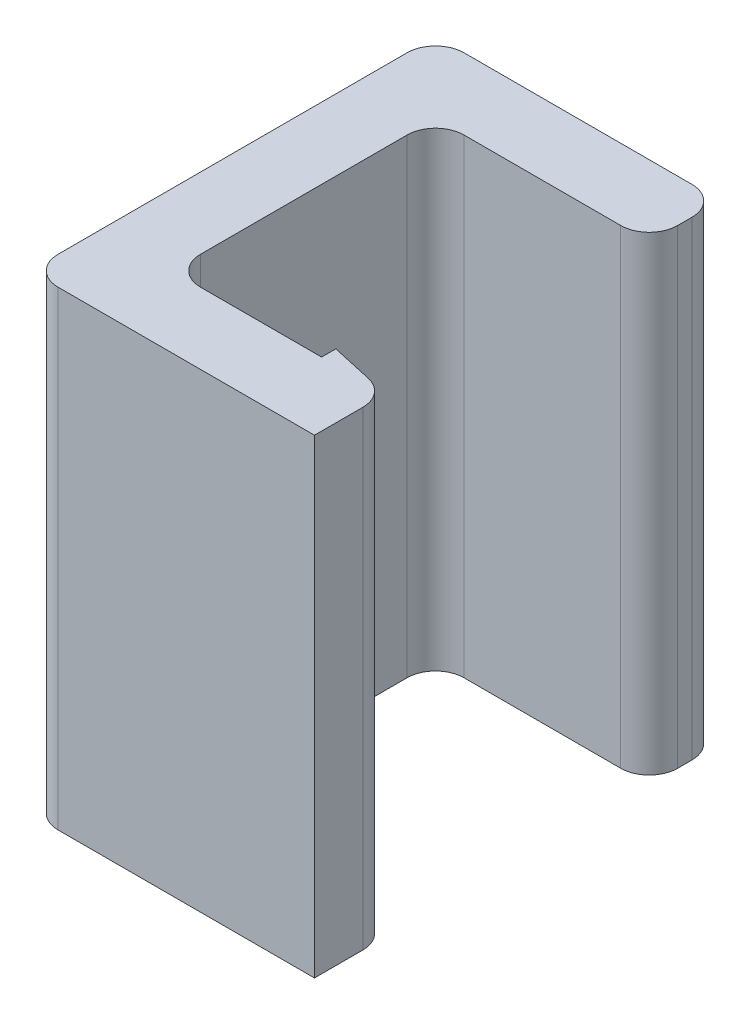
ISO-10303-21;
HEADER;
FILE_DESCRIPTION(('STEP AP214'),'2;1');
FILE_NAME('part.step','',(''),(''),'','','');
FILE_SCHEMA(('AUTOMOTIVE_DESIGN { 1 0 10303 214 1 1 1 1 }'));
ENDSEC;
DATA;
#1=APPLICATION_CONTEXT('core data for automotive mechanical design processes');
#2=APPLICATION_PROTOCOL_DEFINITION('international standard','automotive_design',2000,#1);
#3=PRODUCT_CONTEXT('',#1,'mechanical');
#4=PRODUCT('Part','Part','',(#3));
#5=PRODUCT_RELATED_PRODUCT_CATEGORY('part','',(#4));
#6=PRODUCT_DEFINITION_FORMATION('','',#4);
#7=PRODUCT_DEFINITION_CONTEXT('part definition',#1,'design');
#8=PRODUCT_DEFINITION('design','',#6,#7);
#9=PRODUCT_DEFINITION_SHAPE('','',#8);
#10=(LENGTH_UNIT() NAMED_UNIT(*) SI_UNIT(.MILLI.,.METRE.));
#11=(NAMED_UNIT(*) PLANE_ANGLE_UNIT() SI_UNIT($,.RADIAN.));
#12=(NAMED_UNIT(*) SI_UNIT($,.STERADIAN.) SOLID_ANGLE_UNIT());
#13=UNCERTAINTY_MEASURE_WITH_UNIT(LENGTH_MEASURE(1.E-05),#10,'distance_accuracy_value','');
#14=(GEOMETRIC_REPRESENTATION_CONTEXT(3) GLOBAL_UNCERTAINTY_ASSIGNED_CONTEXT((#13)) GLOBAL_UNIT_ASSIGNED_CONTEXT((#10,
#11,#12)) REPRESENTATION_CONTEXT('',''));
#15=CARTESIAN_POINT('',(0.,0.,0.));
#16=DIRECTION('',(0.,0.,1.));
#17=DIRECTION('',(1.,0.,0.));
#18=AXIS2_PLACEMENT_3D('',#15,#16,#17);
#19=CARTESIAN_POINT('',(0.705882352941176,33.,-3.17647058823529));
#20=DIRECTION('',(-0.216930457818656,0.,0.976187060183953));
#21=DIRECTION('',(0.976187060183953,0.,0.216930457818656));
#22=AXIS2_PLACEMENT_3D('',#19,#20,#21);
#23=PLANE('',#22);
#24=DIRECTION('',(-0.976187060183953,0.,-0.216930457818656));
#25=VECTOR('',#24,1.);
#26=CARTESIAN_POINT('',(0.705882352941176,33.,-3.17647058823529));
#27=LINE('',#26,#25);
#28=CARTESIAN_POINT('',(13.4338609156373,33.,-0.348030907636152));
#29=VERTEX_POINT('',#28);
#30=CARTESIAN_POINT('',(10.5,33.,-1.));
#31=VERTEX_POINT('',#30);
#32=EDGE_CURVE('E168',#29,#31,#27,.T.);
#33=ORIENTED_EDGE('',*,*,#32,.F.);
#34=DIRECTION('',(0.,-1.,0.));
#35=VECTOR('',#34,1.);
#36=CARTESIAN_POINT('',(13.4338609156373,33.,-0.348030907636152));
#37=LINE('',#36,#35);
#38=CARTESIAN_POINT('',(13.4338609156373,0.,-0.348030907636152));
#39=VERTEX_POINT('',#38);
#40=EDGE_CURVE('E242',#29,#39,#37,.T.);
#41=ORIENTED_EDGE('',*,*,#40,.T.);
#42=DIRECTION('',(-0.976187060183953,0.,-0.216930457818656));
#43=VECTOR('',#42,1.);
#44=CARTESIAN_POINT('',(0.705882352941176,0.,-3.17647058823529));
#45=LINE('',#44,#43);
#46=CARTESIAN_POINT('',(10.5,0.,-1.));
#47=VERTEX_POINT('',#46);
#48=EDGE_CURVE('E195',#39,#47,#45,.T.);
#49=ORIENTED_EDGE('',*,*,#48,.T.);
#50=DIRECTION('',(0.,-1.,0.));
#51=VECTOR('',#50,1.);
#52=CARTESIAN_POINT('',(10.5,33.,-1.));
#53=LINE('',#52,#51);
#54=EDGE_CURVE('E187',#31,#47,#53,.T.);
#55=ORIENTED_EDGE('',*,*,#54,.F.);
#56=EDGE_LOOP('',(#33,#41,#49,#55));
#57=FACE_BOUND('',#56,.T.);
#58=ADVANCED_FACE('F45',(#57),#23,.F.);
#59=CARTESIAN_POINT('',(10.5,33.,0.));
#60=DIRECTION('',(1.,0.,0.));
#61=DIRECTION('',(0.,0.,-1.));
#62=AXIS2_PLACEMENT_3D('',#59,#60,#61);
#63=PLANE('',#62);
#64=DIRECTION('',(0.,0.,1.));
#65=VECTOR('',#64,1.);
#66=CARTESIAN_POINT('',(10.5,0.,0.));
#67=LINE('',#66,#65);
#68=CARTESIAN_POINT('',(10.5,0.,0.));
#69=VERTEX_POINT('',#68);
#70=EDGE_CURVE('E309',#47,#69,#67,.T.);
#71=ORIENTED_EDGE('',*,*,#70,.T.);
#72=DIRECTION('',(0.,-1.,0.));
#73=VECTOR('',#72,1.);
#74=CARTESIAN_POINT('',(10.5,33.,0.));
#75=LINE('',#74,#73);
#76=CARTESIAN_POINT('',(10.5,33.,0.));
#77=VERTEX_POINT('',#76);
#78=EDGE_CURVE('E189',#77,#69,#75,.T.);
#79=ORIENTED_EDGE('',*,*,#78,.F.);
#80=DIRECTION('',(0.,0.,1.));
#81=VECTOR('',#80,1.);
#82=CARTESIAN_POINT('',(10.5,33.,0.));
#83=LINE('',#82,#81);
#84=EDGE_CURVE('E173',#31,#77,#83,.T.);
#85=ORIENTED_EDGE('',*,*,#84,.F.);
#86=ORIENTED_EDGE('',*,*,#54,.T.);
#87=EDGE_LOOP('',(#71,#79,#85,#86));
#88=FACE_BOUND('',#87,.T.);
#89=ADVANCED_FACE('F186',(#88),#63,.F.);
#90=CARTESIAN_POINT('',(0.,33.,0.));
#91=DIRECTION('',(0.,0.,1.));
#92=DIRECTION('',(1.,0.,0.));
#93=AXIS2_PLACEMENT_3D('',#90,#91,#92);
#94=PLANE('',#93);
#95=DIRECTION('',(-1.,0.,0.));
#96=VECTOR('',#95,1.);
#97=CARTESIAN_POINT('',(0.,0.,0.));
#98=LINE('',#97,#96);
#99=CARTESIAN_POINT('',(2.,0.,0.));
#100=VERTEX_POINT('',#99);
#101=EDGE_CURVE('E280',#69,#100,#98,.T.);
#102=ORIENTED_EDGE('',*,*,#101,.T.);
#103=DIRECTION('',(0.,-1.,0.));
#104=VECTOR('',#103,1.);
#105=CARTESIAN_POINT('',(2.,33.,0.));
#106=LINE('',#105,#104);
#107=CARTESIAN_POINT('',(2.,33.,0.));
#108=VERTEX_POINT('',#107);
#109=EDGE_CURVE('E257',#100,#108,#106,.F.);
#110=ORIENTED_EDGE('',*,*,#109,.T.);
#111=DIRECTION('',(-1.,0.,0.));
#112=VECTOR('',#111,1.);
#113=CARTESIAN_POINT('',(0.,33.,0.));
#114=LINE('',#113,#112);
#115=EDGE_CURVE('E192',#77,#108,#114,.T.);
#116=ORIENTED_EDGE('',*,*,#115,.F.);
#117=ORIENTED_EDGE('',*,*,#78,.T.);
#118=EDGE_LOOP('',(#102,#110,#116,#117));
#119=FACE_BOUND('',#118,.T.);
#120=ADVANCED_FACE('F353',(#119),#94,.F.);
#121=CARTESIAN_POINT('',(0.,33.,0.));
#122=DIRECTION('',(-1.,0.,0.));
#123=DIRECTION('',(0.,0.,1.));
#124=AXIS2_PLACEMENT_3D('',#121,#122,#123);
#125=PLANE('',#124);
#126=DIRECTION('',(0.,0.,-1.));
#127=VECTOR('',#126,1.);
#128=CARTESIAN_POINT('',(0.,33.,0.));
#129=LINE('',#128,#127);
#130=CARTESIAN_POINT('',(0.,33.,-2.));
#131=VERTEX_POINT('',#130);
#132=CARTESIAN_POINT('',(0.,33.,-16.5));
#133=VERTEX_POINT('',#132);
#134=EDGE_CURVE('E287',#131,#133,#129,.T.);
#135=ORIENTED_EDGE('',*,*,#134,.F.);
#136=DIRECTION('',(0.,-1.,0.));
#137=VECTOR('',#136,1.);
#138=CARTESIAN_POINT('',(0.,0.,-2.));
#139=LINE('',#138,#137);
#140=CARTESIAN_POINT('',(0.,0.,-2.));
#141=VERTEX_POINT('',#140);
#142=EDGE_CURVE('E253',#131,#141,#139,.T.);
#143=ORIENTED_EDGE('',*,*,#142,.T.);
#144=DIRECTION('',(0.,0.,-1.));
#145=VECTOR('',#144,1.);
#146=CARTESIAN_POINT('',(0.,0.,0.));
#147=LINE('',#146,#145);
#148=CARTESIAN_POINT('',(0.,0.,-16.5));
#149=VERTEX_POINT('',#148);
#150=EDGE_CURVE('E269',#141,#149,#147,.T.);
#151=ORIENTED_EDGE('',*,*,#150,.T.);
#152=DIRECTION('',(0.,-1.,0.));
#153=VECTOR('',#152,1.);
#154=CARTESIAN_POINT('',(0.,33.,-16.5));
#155=LINE('',#154,#153);
#156=EDGE_CURVE('E251',#149,#133,#155,.F.);
#157=ORIENTED_EDGE('',*,*,#156,.T.);
#158=EDGE_LOOP('',(#135,#143,#151,#157));
#159=FACE_BOUND('',#158,.T.);
#160=ADVANCED_FACE('F277',(#159),#125,.F.);
#161=CARTESIAN_POINT('',(0.,33.,-18.5));
#162=DIRECTION('',(0.,0.,-1.));
#163=DIRECTION('',(-1.,0.,0.));
#164=AXIS2_PLACEMENT_3D('',#161,#162,#163);
#165=PLANE('',#164);
#166=DIRECTION('',(1.,0.,0.));
#167=VECTOR('',#166,1.);
#168=CARTESIAN_POINT('',(0.,0.,-18.5));
#169=LINE('',#168,#167);
#170=CARTESIAN_POINT('',(2.,0.,-18.5));
#171=VERTEX_POINT('',#170);
#172=CARTESIAN_POINT('',(13.,0.,-18.5));
#173=VERTEX_POINT('',#172);
#174=EDGE_CURVE('E271',#171,#173,#169,.T.);
#175=ORIENTED_EDGE('',*,*,#174,.T.);
#176=DIRECTION('',(0.,-1.,0.));
#177=VECTOR('',#176,1.);
#178=CARTESIAN_POINT('',(13.,33.,-18.5));
#179=LINE('',#178,#177);
#180=CARTESIAN_POINT('',(13.,33.,-18.5));
#181=VERTEX_POINT('',#180);
#182=EDGE_CURVE('E249',#173,#181,#179,.F.);
#183=ORIENTED_EDGE('',*,*,#182,.T.);
#184=DIRECTION('',(1.,0.,0.));
#185=VECTOR('',#184,1.);
#186=CARTESIAN_POINT('',(0.,33.,-18.5));
#187=LINE('',#186,#185);
#188=CARTESIAN_POINT('',(2.,33.,-18.5));
#189=VERTEX_POINT('',#188);
#190=EDGE_CURVE('E285',#189,#181,#187,.T.);
#191=ORIENTED_EDGE('',*,*,#190,.F.);
#192=DIRECTION('',(0.,-1.,0.));
#193=VECTOR('',#192,1.);
#194=CARTESIAN_POINT('',(2.,0.,-18.5));
#195=LINE('',#194,#193);
#196=EDGE_CURVE('E246',#189,#171,#195,.T.);
#197=ORIENTED_EDGE('',*,*,#196,.T.);
#198=EDGE_LOOP('',(#175,#183,#191,#197));
#199=FACE_BOUND('',#198,.T.);
#200=ADVANCED_FACE('F289',(#199),#165,.F.);
#201=CARTESIAN_POINT('',(15.,33.,0.));
#202=DIRECTION('',(-1.,0.,0.));
#203=DIRECTION('',(0.,0.,1.));
#204=AXIS2_PLACEMENT_3D('',#201,#202,#203);
#205=PLANE('',#204);
#206=DIRECTION('',(0.,0.,-1.));
#207=VECTOR('',#206,1.);
#208=CARTESIAN_POINT('',(15.,0.,0.));
#209=LINE('',#208,#207);
#210=CARTESIAN_POINT('',(15.,0.,-20.5));
#211=VERTEX_POINT('',#210);
#212=CARTESIAN_POINT('',(15.,0.,-21.5));
#213=VERTEX_POINT('',#212);
#214=EDGE_CURVE('E314',#211,#213,#209,.T.);
#215=ORIENTED_EDGE('',*,*,#214,.T.);
#216=DIRECTION('',(0.,-1.,0.));
#217=VECTOR('',#216,1.);
#218=CARTESIAN_POINT('',(15.,33.,-21.5));
#219=LINE('',#218,#217);
#220=CARTESIAN_POINT('',(15.,33.,-21.5));
#221=VERTEX_POINT('',#220);
#222=EDGE_CURVE('E223',#213,#221,#219,.F.);
#223=ORIENTED_EDGE('',*,*,#222,.T.);
#224=DIRECTION('',(0.,0.,-1.));
#225=VECTOR('',#224,1.);
#226=CARTESIAN_POINT('',(15.,33.,0.));
#227=LINE('',#226,#225);
#228=CARTESIAN_POINT('',(15.,33.,-20.5));
#229=VERTEX_POINT('',#228);
#230=EDGE_CURVE('E291',#229,#221,#227,.T.);
#231=ORIENTED_EDGE('',*,*,#230,.F.);
#232=DIRECTION('',(0.,-1.,0.));
#233=VECTOR('',#232,1.);
#234=CARTESIAN_POINT('',(15.,33.,-20.5));
#235=LINE('',#234,#233);
#236=EDGE_CURVE('E220',#229,#211,#235,.T.);
#237=ORIENTED_EDGE('',*,*,#236,.T.);
#238=EDGE_LOOP('',(#215,#223,#231,#237));
#239=FACE_BOUND('',#238,.T.);
#240=ADVANCED_FACE('F383',(#239),#205,.F.);
#241=CARTESIAN_POINT('',(0.,33.,-23.5));
#242=DIRECTION('',(0.,0.,1.));
#243=DIRECTION('',(1.,0.,0.));
#244=AXIS2_PLACEMENT_3D('',#241,#242,#243);
#245=PLANE('',#244);
#246=DIRECTION('',(-1.,0.,0.));
#247=VECTOR('',#246,1.);
#248=CARTESIAN_POINT('',(0.,33.,-23.5));
#249=LINE('',#248,#247);
#250=CARTESIAN_POINT('',(13.,33.,-23.5));
#251=VERTEX_POINT('',#250);
#252=CARTESIAN_POINT('',(-3.,33.,-23.5));
#253=VERTEX_POINT('',#252);
#254=EDGE_CURVE('E293',#251,#253,#249,.T.);
#255=ORIENTED_EDGE('',*,*,#254,.F.);
#256=DIRECTION('',(0.,-1.,0.));
#257=VECTOR('',#256,1.);
#258=CARTESIAN_POINT('',(13.,33.,-23.5));
#259=LINE('',#258,#257);
#260=CARTESIAN_POINT('',(13.,0.,-23.5));
#261=VERTEX_POINT('',#260);
#262=EDGE_CURVE('E201',#251,#261,#259,.T.);
#263=ORIENTED_EDGE('',*,*,#262,.T.);
#264=DIRECTION('',(-1.,0.,0.));
#265=VECTOR('',#264,1.);
#266=CARTESIAN_POINT('',(0.,0.,-23.5));
#267=LINE('',#266,#265);
#268=CARTESIAN_POINT('',(-3.,0.,-23.5));
#269=VERTEX_POINT('',#268);
#270=EDGE_CURVE('E317',#261,#269,#267,.T.);
#271=ORIENTED_EDGE('',*,*,#270,.T.);
#272=DIRECTION('',(0.,-1.,0.));
#273=VECTOR('',#272,1.);
#274=CARTESIAN_POINT('',(-3.,33.,-23.5));
#275=LINE('',#274,#273);
#276=EDGE_CURVE('E198',#269,#253,#275,.F.);
#277=ORIENTED_EDGE('',*,*,#276,.T.);
#278=EDGE_LOOP('',(#255,#263,#271,#277));
#279=FACE_BOUND('',#278,.T.);
#280=ADVANCED_FACE('F376',(#279),#245,.F.);
#281=CARTESIAN_POINT('',(-5.,33.,0.));
#282=DIRECTION('',(1.,0.,0.));
#283=DIRECTION('',(0.,0.,-1.));
#284=AXIS2_PLACEMENT_3D('',#281,#282,#283);
#285=PLANE('',#284);
#286=DIRECTION('',(0.,0.,1.));
#287=VECTOR('',#286,1.);
#288=CARTESIAN_POINT('',(-5.,0.,0.));
#289=LINE('',#288,#287);
#290=CARTESIAN_POINT('',(-5.,0.,-21.5));
#291=VERTEX_POINT('',#290);
#292=CARTESIAN_POINT('',(-5.,0.,3.));
#293=VERTEX_POINT('',#292);
#294=EDGE_CURVE('E320',#291,#293,#289,.T.);
#295=ORIENTED_EDGE('',*,*,#294,.T.);
#296=DIRECTION('',(0.,-1.,0.));
#297=VECTOR('',#296,1.);
#298=CARTESIAN_POINT('',(-5.,33.,3.));
#299=LINE('',#298,#297);
#300=CARTESIAN_POINT('',(-5.,33.,3.));
#301=VERTEX_POINT('',#300);
#302=EDGE_CURVE('E240',#293,#301,#299,.F.);
#303=ORIENTED_EDGE('',*,*,#302,.T.);
#304=DIRECTION('',(0.,0.,1.));
#305=VECTOR('',#304,1.);
#306=CARTESIAN_POINT('',(-5.,33.,0.));
#307=LINE('',#306,#305);
#308=CARTESIAN_POINT('',(-5.,33.,-21.5));
#309=VERTEX_POINT('',#308);
#310=EDGE_CURVE('E300',#309,#301,#307,.T.);
#311=ORIENTED_EDGE('',*,*,#310,.F.);
#312=DIRECTION('',(0.,-1.,0.));
#313=VECTOR('',#312,1.);
#314=CARTESIAN_POINT('',(-5.,33.,-21.5));
#315=LINE('',#314,#313);
#316=EDGE_CURVE('E237',#309,#291,#315,.T.);
#317=ORIENTED_EDGE('',*,*,#316,.T.);
#318=EDGE_LOOP('',(#295,#303,#311,#317));
#319=FACE_BOUND('',#318,.T.);
#320=ADVANCED_FACE('F369',(#319),#285,.F.);
#321=CARTESIAN_POINT('',(0.,33.,5.));
#322=DIRECTION('',(0.,0.,-1.));
#323=DIRECTION('',(-1.,0.,0.));
#324=AXIS2_PLACEMENT_3D('',#321,#322,#323);
#325=PLANE('',#324);
#326=DIRECTION('',(1.,0.,0.));
#327=VECTOR('',#326,1.);
#328=CARTESIAN_POINT('',(0.,33.,5.));
#329=LINE('',#328,#327);
#330=CARTESIAN_POINT('',(-3.,33.,5.));
#331=VERTEX_POINT('',#330);
#332=CARTESIAN_POINT('',(15.,33.,5.));
#333=VERTEX_POINT('',#332);
#334=EDGE_CURVE('E303',#331,#333,#329,.T.);
#335=ORIENTED_EDGE('',*,*,#334,.F.);
#336=DIRECTION('',(0.,-1.,0.));
#337=VECTOR('',#336,1.);
#338=CARTESIAN_POINT('',(-3.,33.,5.));
#339=LINE('',#338,#337);
#340=CARTESIAN_POINT('',(-3.,0.,5.));
#341=VERTEX_POINT('',#340);
#342=EDGE_CURVE('E234',#331,#341,#339,.T.);
#343=ORIENTED_EDGE('',*,*,#342,.T.);
#344=DIRECTION('',(1.,0.,0.));
#345=VECTOR('',#344,1.);
#346=CARTESIAN_POINT('',(0.,0.,5.));
#347=LINE('',#346,#345);
#348=CARTESIAN_POINT('',(15.,0.,5.));
#349=VERTEX_POINT('',#348);
#350=EDGE_CURVE('E323',#341,#349,#347,.T.);
#351=ORIENTED_EDGE('',*,*,#350,.T.);
#352=DIRECTION('',(0.,-1.,0.));
#353=VECTOR('',#352,1.);
#354=CARTESIAN_POINT('',(15.,33.,5.));
#355=LINE('',#354,#353);
#356=EDGE_CURVE('E203',#333,#349,#355,.T.);
#357=ORIENTED_EDGE('',*,*,#356,.F.);
#358=EDGE_LOOP('',(#335,#343,#351,#357));
#359=FACE_BOUND('',#358,.T.);
#360=ADVANCED_FACE('F367',(#359),#325,.F.);
#361=CARTESIAN_POINT('',(15.,33.,0.));
#362=DIRECTION('',(-1.,0.,0.));
#363=DIRECTION('',(0.,0.,1.));
#364=AXIS2_PLACEMENT_3D('',#361,#362,#363);
#365=PLANE('',#364);
#366=DIRECTION('',(0.,0.,-1.));
#367=VECTOR('',#366,1.);
#368=CARTESIAN_POINT('',(15.,0.,0.));
#369=LINE('',#368,#367);
#370=CARTESIAN_POINT('',(15.,0.,1.60434321273175));
#371=VERTEX_POINT('',#370);
#372=EDGE_CURVE('E182',#349,#371,#369,.T.);
#373=ORIENTED_EDGE('',*,*,#372,.T.);
#374=DIRECTION('',(0.,-1.,0.));
#375=VECTOR('',#374,1.);
#376=CARTESIAN_POINT('',(15.,33.,1.60434321273175));
#377=LINE('',#376,#375);
#378=CARTESIAN_POINT('',(15.,33.,1.60434321273175));
#379=VERTEX_POINT('',#378);
#380=EDGE_CURVE('E60',#371,#379,#377,.F.);
#381=ORIENTED_EDGE('',*,*,#380,.T.);
#382=DIRECTION('',(0.,0.,-1.));
#383=VECTOR('',#382,1.);
#384=CARTESIAN_POINT('',(15.,33.,0.));
#385=LINE('',#384,#383);
#386=EDGE_CURVE('E305',#333,#379,#385,.T.);
#387=ORIENTED_EDGE('',*,*,#386,.F.);
#388=ORIENTED_EDGE('',*,*,#356,.T.);
#389=EDGE_LOOP('',(#373,#381,#387,#388));
#390=FACE_BOUND('',#389,.T.);
#391=ADVANCED_FACE('F329',(#390),#365,.F.);
#392=CARTESIAN_POINT('',(0.,33.,0.));
#393=DIRECTION('',(0.,1.,0.));
#394=DIRECTION('',(0.,0.,1.));
#395=AXIS2_PLACEMENT_3D('',#392,#393,#394);
#396=PLANE('',#395);
#397=ORIENTED_EDGE('',*,*,#230,.T.);
#398=CARTESIAN_POINT('',(13.,33.,-21.5));
#399=DIRECTION('',(0.,1.,0.));
#400=DIRECTION('',(0.,0.,1.));
#401=AXIS2_PLACEMENT_3D('',#398,#399,#400);
#402=CIRCLE('',#401,2.);
#403=EDGE_CURVE('E232',#221,#251,#402,.T.);
#404=ORIENTED_EDGE('',*,*,#403,.T.);
#405=ORIENTED_EDGE('',*,*,#254,.T.);
#406=CARTESIAN_POINT('',(-3.,33.,-21.5));
#407=DIRECTION('',(0.,1.,0.));
#408=DIRECTION('',(0.,0.,1.));
#409=AXIS2_PLACEMENT_3D('',#406,#407,#408);
#410=CIRCLE('',#409,2.);
#411=EDGE_CURVE('E229',#253,#309,#410,.T.);
#412=ORIENTED_EDGE('',*,*,#411,.T.);
#413=ORIENTED_EDGE('',*,*,#310,.T.);
#414=CARTESIAN_POINT('',(-3.,33.,3.));
#415=DIRECTION('',(0.,1.,0.));
#416=DIRECTION('',(0.,0.,1.));
#417=AXIS2_PLACEMENT_3D('',#414,#415,#416);
#418=CIRCLE('',#417,2.);
#419=EDGE_CURVE('E68',#301,#331,#418,.T.);
#420=ORIENTED_EDGE('',*,*,#419,.T.);
#421=ORIENTED_EDGE('',*,*,#334,.T.);
#422=ORIENTED_EDGE('',*,*,#386,.T.);
#423=CARTESIAN_POINT('',(13.,33.,1.60434321273175));
#424=DIRECTION('',(0.,1.,0.));
#425=DIRECTION('',(0.,0.,1.));
#426=AXIS2_PLACEMENT_3D('',#423,#424,#425);
#427=CIRCLE('',#426,2.);
#428=EDGE_CURVE('E176',#379,#29,#427,.T.);
#429=ORIENTED_EDGE('',*,*,#428,.T.);
#430=ORIENTED_EDGE('',*,*,#32,.T.);
#431=ORIENTED_EDGE('',*,*,#84,.T.);
#432=ORIENTED_EDGE('',*,*,#115,.T.);
#433=CARTESIAN_POINT('',(2.,33.,-2.));
#434=DIRECTION('',(0.,1.,0.));
#435=DIRECTION('',(0.,0.,1.));
#436=AXIS2_PLACEMENT_3D('',#433,#434,#435);
#437=CIRCLE('',#436,2.);
#438=EDGE_CURVE('E262',#108,#131,#437,.F.);
#439=ORIENTED_EDGE('',*,*,#438,.T.);
#440=ORIENTED_EDGE('',*,*,#134,.T.);
#441=CARTESIAN_POINT('',(2.,33.,-16.5));
#442=DIRECTION('',(0.,1.,0.));
#443=DIRECTION('',(0.,0.,1.));
#444=AXIS2_PLACEMENT_3D('',#441,#442,#443);
#445=CIRCLE('',#444,2.);
#446=EDGE_CURVE('E11',#133,#189,#445,.F.);
#447=ORIENTED_EDGE('',*,*,#446,.T.);
#448=ORIENTED_EDGE('',*,*,#190,.T.);
#449=CARTESIAN_POINT('',(13.,33.,-20.5));
#450=DIRECTION('',(0.,1.,0.));
#451=DIRECTION('',(0.,0.,1.));
#452=AXIS2_PLACEMENT_3D('',#449,#450,#451);
#453=CIRCLE('',#452,2.);
#454=EDGE_CURVE('E225',#181,#229,#453,.T.);
#455=ORIENTED_EDGE('',*,*,#454,.T.);
#456=EDGE_LOOP('',(#397,#404,#405,#412,#413,#420,#421,#422,#429,#430,#431,#432,#439,#440,#447,
#448,#455));
#457=FACE_BOUND('',#456,.T.);
#458=ADVANCED_FACE('F171',(#457),#396,.T.);
#459=CARTESIAN_POINT('',(0.,0.,0.));
#460=DIRECTION('',(0.,1.,0.));
#461=DIRECTION('',(0.,0.,1.));
#462=AXIS2_PLACEMENT_3D('',#459,#460,#461);
#463=PLANE('',#462);
#464=ORIENTED_EDGE('',*,*,#270,.F.);
#465=CARTESIAN_POINT('',(13.,0.,-21.5));
#466=DIRECTION('',(0.,1.,0.));
#467=DIRECTION('',(0.,0.,1.));
#468=AXIS2_PLACEMENT_3D('',#465,#466,#467);
#469=CIRCLE('',#468,2.);
#470=EDGE_CURVE('E218',#261,#213,#469,.F.);
#471=ORIENTED_EDGE('',*,*,#470,.T.);
#472=ORIENTED_EDGE('',*,*,#214,.F.);
#473=CARTESIAN_POINT('',(13.,0.,-20.5));
#474=DIRECTION('',(0.,1.,0.));
#475=DIRECTION('',(0.,0.,1.));
#476=AXIS2_PLACEMENT_3D('',#473,#474,#475);
#477=CIRCLE('',#476,2.);
#478=EDGE_CURVE('E209',#211,#173,#477,.F.);
#479=ORIENTED_EDGE('',*,*,#478,.T.);
#480=ORIENTED_EDGE('',*,*,#174,.F.);
#481=CARTESIAN_POINT('',(2.,0.,-16.5));
#482=DIRECTION('',(0.,1.,0.));
#483=DIRECTION('',(0.,0.,1.));
#484=AXIS2_PLACEMENT_3D('',#481,#482,#483);
#485=CIRCLE('',#484,2.);
#486=EDGE_CURVE('E53',#171,#149,#485,.T.);
#487=ORIENTED_EDGE('',*,*,#486,.T.);
#488=ORIENTED_EDGE('',*,*,#150,.F.);
#489=CARTESIAN_POINT('',(2.,0.,-2.));
#490=DIRECTION('',(0.,1.,0.));
#491=DIRECTION('',(0.,0.,1.));
#492=AXIS2_PLACEMENT_3D('',#489,#490,#491);
#493=CIRCLE('',#492,2.);
#494=EDGE_CURVE('E260',#141,#100,#493,.T.);
#495=ORIENTED_EDGE('',*,*,#494,.T.);
#496=ORIENTED_EDGE('',*,*,#101,.F.);
#497=ORIENTED_EDGE('',*,*,#70,.F.);
#498=ORIENTED_EDGE('',*,*,#48,.F.);
#499=CARTESIAN_POINT('',(13.,0.,1.60434321273175));
#500=DIRECTION('',(0.,1.,0.));
#501=DIRECTION('',(0.,0.,1.));
#502=AXIS2_PLACEMENT_3D('',#499,#500,#501);
#503=CIRCLE('',#502,2.);
#504=EDGE_CURVE('E211',#39,#371,#503,.F.);
#505=ORIENTED_EDGE('',*,*,#504,.T.);
#506=ORIENTED_EDGE('',*,*,#372,.F.);
#507=ORIENTED_EDGE('',*,*,#350,.F.);
#508=CARTESIAN_POINT('',(-3.,0.,3.));
#509=DIRECTION('',(0.,1.,0.));
#510=DIRECTION('',(0.,0.,1.));
#511=AXIS2_PLACEMENT_3D('',#508,#509,#510);
#512=CIRCLE('',#511,2.);
#513=EDGE_CURVE('E216',#341,#293,#512,.F.);
#514=ORIENTED_EDGE('',*,*,#513,.T.);
#515=ORIENTED_EDGE('',*,*,#294,.F.);
#516=CARTESIAN_POINT('',(-3.,0.,-21.5));
#517=DIRECTION('',(0.,1.,0.));
#518=DIRECTION('',(0.,0.,1.));
#519=AXIS2_PLACEMENT_3D('',#516,#517,#518);
#520=CIRCLE('',#519,2.);
#521=EDGE_CURVE('E214',#291,#269,#520,.F.);
#522=ORIENTED_EDGE('',*,*,#521,.T.);
#523=EDGE_LOOP('',(#464,#471,#472,#479,#480,#487,#488,#495,#496,#497,#498,#505,#506,#507,#514,
#515,#522));
#524=FACE_BOUND('',#523,.T.);
#525=ADVANCED_FACE('F268',(#524),#463,.F.);
#526=CARTESIAN_POINT('',(13.,33.,-21.5));
#527=DIRECTION('',(0.,-1.,0.));
#528=DIRECTION('',(0.,0.,-1.));
#529=AXIS2_PLACEMENT_3D('',#526,#527,#528);
#530=CYLINDRICAL_SURFACE('',#529,2.);
#531=ORIENTED_EDGE('',*,*,#403,.F.);
#532=ORIENTED_EDGE('',*,*,#222,.F.);
#533=ORIENTED_EDGE('',*,*,#470,.F.);
#534=ORIENTED_EDGE('',*,*,#262,.F.);
#535=EDGE_LOOP('',(#531,#532,#533,#534));
#536=FACE_BOUND('',#535,.T.);
#537=ADVANCED_FACE('F357',(#536),#530,.T.);
#538=CARTESIAN_POINT('',(-3.,33.,3.));
#539=DIRECTION('',(0.,-1.,0.));
#540=DIRECTION('',(0.,0.,-1.));
#541=AXIS2_PLACEMENT_3D('',#538,#539,#540);
#542=CYLINDRICAL_SURFACE('',#541,2.);
#543=ORIENTED_EDGE('',*,*,#419,.F.);
#544=ORIENTED_EDGE('',*,*,#302,.F.);
#545=ORIENTED_EDGE('',*,*,#513,.F.);
#546=ORIENTED_EDGE('',*,*,#342,.F.);
#547=EDGE_LOOP('',(#543,#544,#545,#546));
#548=FACE_BOUND('',#547,.T.);
#549=ADVANCED_FACE('F345',(#548),#542,.T.);
#550=CARTESIAN_POINT('',(-3.,33.,-21.5));
#551=DIRECTION('',(0.,-1.,0.));
#552=DIRECTION('',(0.,0.,-1.));
#553=AXIS2_PLACEMENT_3D('',#550,#551,#552);
#554=CYLINDRICAL_SURFACE('',#553,2.);
#555=ORIENTED_EDGE('',*,*,#411,.F.);
#556=ORIENTED_EDGE('',*,*,#276,.F.);
#557=ORIENTED_EDGE('',*,*,#521,.F.);
#558=ORIENTED_EDGE('',*,*,#316,.F.);
#559=EDGE_LOOP('',(#555,#556,#557,#558));
#560=FACE_BOUND('',#559,.T.);
#561=ADVANCED_FACE('F336',(#560),#554,.T.);
#562=CARTESIAN_POINT('',(13.,33.,1.60434321273175));
#563=DIRECTION('',(0.,-1.,0.));
#564=DIRECTION('',(0.,0.,-1.));
#565=AXIS2_PLACEMENT_3D('',#562,#563,#564);
#566=CYLINDRICAL_SURFACE('',#565,2.);
#567=ORIENTED_EDGE('',*,*,#428,.F.);
#568=ORIENTED_EDGE('',*,*,#380,.F.);
#569=ORIENTED_EDGE('',*,*,#504,.F.);
#570=ORIENTED_EDGE('',*,*,#40,.F.);
#571=EDGE_LOOP('',(#567,#568,#569,#570));
#572=FACE_BOUND('',#571,.T.);
#573=ADVANCED_FACE('F333',(#572),#566,.T.);
#574=CARTESIAN_POINT('',(13.,33.,-20.5));
#575=DIRECTION('',(0.,-1.,0.));
#576=DIRECTION('',(0.,0.,-1.));
#577=AXIS2_PLACEMENT_3D('',#574,#575,#576);
#578=CYLINDRICAL_SURFACE('',#577,2.);
#579=ORIENTED_EDGE('',*,*,#454,.F.);
#580=ORIENTED_EDGE('',*,*,#182,.F.);
#581=ORIENTED_EDGE('',*,*,#478,.F.);
#582=ORIENTED_EDGE('',*,*,#236,.F.);
#583=EDGE_LOOP('',(#579,#580,#581,#582));
#584=FACE_BOUND('',#583,.T.);
#585=ADVANCED_FACE('F335',(#584),#578,.T.);
#586=CARTESIAN_POINT('',(2.,33.,-2.));
#587=DIRECTION('',(0.,1.,0.));
#588=DIRECTION('',(0.,0.,1.));
#589=AXIS2_PLACEMENT_3D('',#586,#587,#588);
#590=CYLINDRICAL_SURFACE('',#589,2.);
#591=ORIENTED_EDGE('',*,*,#438,.F.);
#592=ORIENTED_EDGE('',*,*,#109,.F.);
#593=ORIENTED_EDGE('',*,*,#494,.F.);
#594=ORIENTED_EDGE('',*,*,#142,.F.);
#595=EDGE_LOOP('',(#591,#592,#593,#594));
#596=FACE_BOUND('',#595,.T.);
#597=ADVANCED_FACE('F342',(#596),#590,.F.);
#598=CARTESIAN_POINT('',(2.,33.,-16.5));
#599=DIRECTION('',(0.,1.,0.));
#600=DIRECTION('',(0.,0.,1.));
#601=AXIS2_PLACEMENT_3D('',#598,#599,#600);
#602=CYLINDRICAL_SURFACE('',#601,2.);
#603=ORIENTED_EDGE('',*,*,#446,.F.);
#604=ORIENTED_EDGE('',*,*,#156,.F.);
#605=ORIENTED_EDGE('',*,*,#486,.F.);
#606=ORIENTED_EDGE('',*,*,#196,.F.);
#607=EDGE_LOOP('',(#603,#604,#605,#606));
#608=FACE_BOUND('',#607,.T.);
#609=ADVANCED_FACE('F47',(#608),#602,.F.);
#610=CLOSED_SHELL('',(#58,#89,#120,#160,#200,#240,#280,#320,#360,#391,#458,#525,#537,#549,#561,
#573,#585,#597,#609));
#611=MANIFOLD_SOLID_BREP('B2',#610);
#612=ADVANCED_BREP_SHAPE_REPRESENTATION('',(#18,#611),#14);
#613=SHAPE_DEFINITION_REPRESENTATION(#9,#612);
ENDSEC;
END-ISO-10303-21;
